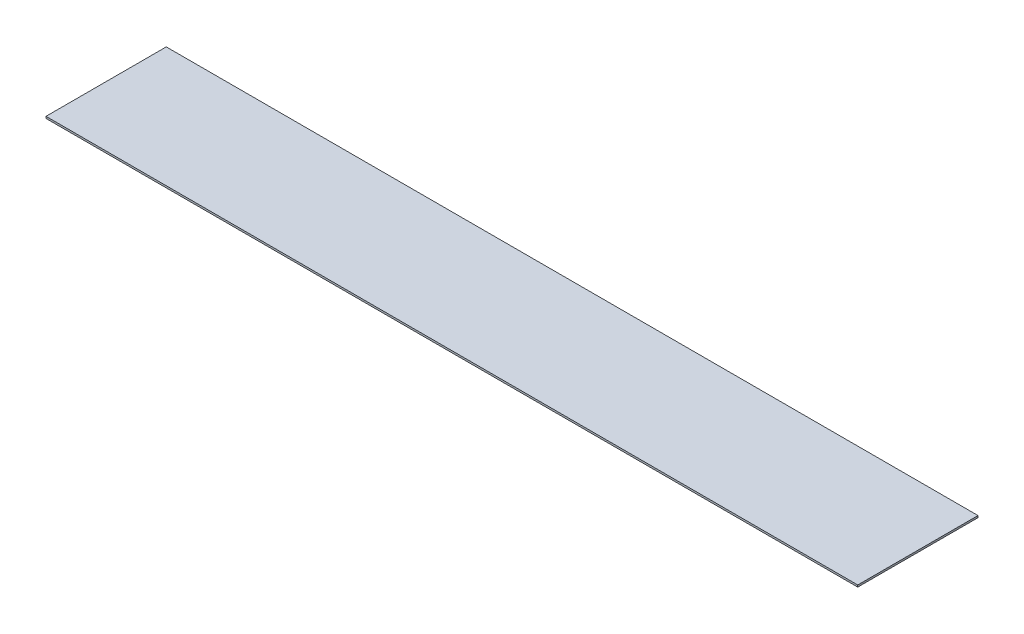
ISO-10303-21;
HEADER;
FILE_DESCRIPTION(('STEP AP214'),'2;1');
FILE_NAME('part.step','',(''),(''),'','','');
FILE_SCHEMA(('AUTOMOTIVE_DESIGN { 1 0 10303 214 1 1 1 1 }'));
ENDSEC;
DATA;
#1=APPLICATION_CONTEXT('core data for automotive mechanical design processes');
#2=APPLICATION_PROTOCOL_DEFINITION('international standard','automotive_design',2000,#1);
#3=PRODUCT_CONTEXT('',#1,'mechanical');
#4=PRODUCT('Part','Part','',(#3));
#5=PRODUCT_RELATED_PRODUCT_CATEGORY('part','',(#4));
#6=PRODUCT_DEFINITION_FORMATION('','',#4);
#7=PRODUCT_DEFINITION_CONTEXT('part definition',#1,'design');
#8=PRODUCT_DEFINITION('design','',#6,#7);
#9=PRODUCT_DEFINITION_SHAPE('','',#8);
#10=(LENGTH_UNIT() NAMED_UNIT(*) SI_UNIT(.MILLI.,.METRE.));
#11=(NAMED_UNIT(*) PLANE_ANGLE_UNIT() SI_UNIT($,.RADIAN.));
#12=(NAMED_UNIT(*) SI_UNIT($,.STERADIAN.) SOLID_ANGLE_UNIT());
#13=UNCERTAINTY_MEASURE_WITH_UNIT(LENGTH_MEASURE(1.E-05),#10,'distance_accuracy_value','');
#14=(GEOMETRIC_REPRESENTATION_CONTEXT(3) GLOBAL_UNCERTAINTY_ASSIGNED_CONTEXT((#13)) GLOBAL_UNIT_ASSIGNED_CONTEXT((#10,
#11,#12)) REPRESENTATION_CONTEXT('',''));
#15=CARTESIAN_POINT('',(0.,0.,0.));
#16=DIRECTION('',(0.,0.,1.));
#17=DIRECTION('',(1.,0.,0.));
#18=AXIS2_PLACEMENT_3D('',#15,#16,#17);
#19=CARTESIAN_POINT('',(0.,1.5875,0.));
#20=DIRECTION('',(1.,0.,0.));
#21=DIRECTION('',(0.,0.,-1.));
#22=AXIS2_PLACEMENT_3D('',#19,#20,#21);
#23=PLANE('',#22);
#24=DIRECTION('',(0.,0.,1.));
#25=VECTOR('',#24,1.);
#26=CARTESIAN_POINT('',(0.,0.,0.));
#27=LINE('',#26,#25);
#28=CARTESIAN_POINT('',(0.,0.,-101.6));
#29=VERTEX_POINT('',#28);
#30=CARTESIAN_POINT('',(0.,0.,0.));
#31=VERTEX_POINT('',#30);
#32=EDGE_CURVE('E96',#29,#31,#27,.T.);
#33=ORIENTED_EDGE('',*,*,#32,.T.);
#34=DIRECTION('',(0.,-1.,0.));
#35=VECTOR('',#34,1.);
#36=CARTESIAN_POINT('',(0.,1.5875,0.));
#37=LINE('',#36,#35);
#38=CARTESIAN_POINT('',(0.,1.5875,0.));
#39=VERTEX_POINT('',#38);
#40=EDGE_CURVE('E11',#39,#31,#37,.T.);
#41=ORIENTED_EDGE('',*,*,#40,.F.);
#42=DIRECTION('',(0.,0.,1.));
#43=VECTOR('',#42,1.);
#44=CARTESIAN_POINT('',(0.,1.5875,0.));
#45=LINE('',#44,#43);
#46=CARTESIAN_POINT('',(0.,1.5875,-101.6));
#47=VERTEX_POINT('',#46);
#48=EDGE_CURVE('E84',#47,#39,#45,.T.);
#49=ORIENTED_EDGE('',*,*,#48,.F.);
#50=DIRECTION('',(0.,-1.,0.));
#51=VECTOR('',#50,1.);
#52=CARTESIAN_POINT('',(0.,1.5875,-101.6));
#53=LINE('',#52,#51);
#54=EDGE_CURVE('E92',#47,#29,#53,.T.);
#55=ORIENTED_EDGE('',*,*,#54,.T.);
#56=EDGE_LOOP('',(#33,#41,#49,#55));
#57=FACE_BOUND('',#56,.T.);
#58=ADVANCED_FACE('F33',(#57),#23,.F.);
#59=CARTESIAN_POINT('',(0.,1.5875,0.));
#60=DIRECTION('',(0.,0.,-1.));
#61=DIRECTION('',(-1.,0.,0.));
#62=AXIS2_PLACEMENT_3D('',#59,#60,#61);
#63=PLANE('',#62);
#64=DIRECTION('',(1.,0.,0.));
#65=VECTOR('',#64,1.);
#66=CARTESIAN_POINT('',(0.,0.,0.));
#67=LINE('',#66,#65);
#68=CARTESIAN_POINT('',(685.8,0.,0.));
#69=VERTEX_POINT('',#68);
#70=EDGE_CURVE('E88',#31,#69,#67,.T.);
#71=ORIENTED_EDGE('',*,*,#70,.T.);
#72=DIRECTION('',(0.,-1.,0.));
#73=VECTOR('',#72,1.);
#74=CARTESIAN_POINT('',(685.8,1.5875,0.));
#75=LINE('',#74,#73);
#76=CARTESIAN_POINT('',(685.8,1.5875,0.));
#77=VERTEX_POINT('',#76);
#78=EDGE_CURVE('E41',#77,#69,#75,.T.);
#79=ORIENTED_EDGE('',*,*,#78,.F.);
#80=DIRECTION('',(1.,0.,0.));
#81=VECTOR('',#80,1.);
#82=CARTESIAN_POINT('',(0.,1.5875,0.));
#83=LINE('',#82,#81);
#84=EDGE_CURVE('E79',#39,#77,#83,.T.);
#85=ORIENTED_EDGE('',*,*,#84,.F.);
#86=ORIENTED_EDGE('',*,*,#40,.T.);
#87=EDGE_LOOP('',(#71,#79,#85,#86));
#88=FACE_BOUND('',#87,.T.);
#89=ADVANCED_FACE('F87',(#88),#63,.F.);
#90=CARTESIAN_POINT('',(685.8,1.5875,0.));
#91=DIRECTION('',(-1.,0.,0.));
#92=DIRECTION('',(0.,0.,1.));
#93=AXIS2_PLACEMENT_3D('',#90,#91,#92);
#94=PLANE('',#93);
#95=DIRECTION('',(0.,0.,-1.));
#96=VECTOR('',#95,1.);
#97=CARTESIAN_POINT('',(685.8,0.,0.));
#98=LINE('',#97,#96);
#99=CARTESIAN_POINT('',(685.8,0.,-101.6));
#100=VERTEX_POINT('',#99);
#101=EDGE_CURVE('E66',#69,#100,#98,.T.);
#102=ORIENTED_EDGE('',*,*,#101,.T.);
#103=DIRECTION('',(0.,-1.,0.));
#104=VECTOR('',#103,1.);
#105=CARTESIAN_POINT('',(685.8,1.5875,-101.6));
#106=LINE('',#105,#104);
#107=CARTESIAN_POINT('',(685.8,1.5875,-101.6));
#108=VERTEX_POINT('',#107);
#109=EDGE_CURVE('E89',#108,#100,#106,.T.);
#110=ORIENTED_EDGE('',*,*,#109,.F.);
#111=DIRECTION('',(0.,0.,-1.));
#112=VECTOR('',#111,1.);
#113=CARTESIAN_POINT('',(685.8,1.5875,0.));
#114=LINE('',#113,#112);
#115=EDGE_CURVE('E82',#77,#108,#114,.T.);
#116=ORIENTED_EDGE('',*,*,#115,.F.);
#117=ORIENTED_EDGE('',*,*,#78,.T.);
#118=EDGE_LOOP('',(#102,#110,#116,#117));
#119=FACE_BOUND('',#118,.T.);
#120=ADVANCED_FACE('F90',(#119),#94,.F.);
#121=CARTESIAN_POINT('',(0.,1.5875,-101.6));
#122=DIRECTION('',(0.,0.,1.));
#123=DIRECTION('',(1.,0.,0.));
#124=AXIS2_PLACEMENT_3D('',#121,#122,#123);
#125=PLANE('',#124);
#126=DIRECTION('',(-1.,0.,0.));
#127=VECTOR('',#126,1.);
#128=CARTESIAN_POINT('',(0.,0.,-101.6));
#129=LINE('',#128,#127);
#130=EDGE_CURVE('E72',#100,#29,#129,.T.);
#131=ORIENTED_EDGE('',*,*,#130,.T.);
#132=ORIENTED_EDGE('',*,*,#54,.F.);
#133=DIRECTION('',(-1.,0.,0.));
#134=VECTOR('',#133,1.);
#135=CARTESIAN_POINT('',(0.,1.5875,-101.6));
#136=LINE('',#135,#134);
#137=EDGE_CURVE('E49',#108,#47,#136,.T.);
#138=ORIENTED_EDGE('',*,*,#137,.F.);
#139=ORIENTED_EDGE('',*,*,#109,.T.);
#140=EDGE_LOOP('',(#131,#132,#138,#139));
#141=FACE_BOUND('',#140,.T.);
#142=ADVANCED_FACE('F103',(#141),#125,.F.);
#143=CARTESIAN_POINT('',(0.,1.5875,0.));
#144=DIRECTION('',(0.,-1.,0.));
#145=DIRECTION('',(0.,0.,-1.));
#146=AXIS2_PLACEMENT_3D('',#143,#144,#145);
#147=PLANE('',#146);
#148=ORIENTED_EDGE('',*,*,#48,.T.);
#149=ORIENTED_EDGE('',*,*,#84,.T.);
#150=ORIENTED_EDGE('',*,*,#115,.T.);
#151=ORIENTED_EDGE('',*,*,#137,.T.);
#152=EDGE_LOOP('',(#148,#149,#150,#151));
#153=FACE_BOUND('',#152,.T.);
#154=ADVANCED_FACE('F80',(#153),#147,.F.);
#155=CARTESIAN_POINT('',(0.,0.,0.));
#156=DIRECTION('',(0.,-1.,0.));
#157=DIRECTION('',(0.,0.,-1.));
#158=AXIS2_PLACEMENT_3D('',#155,#156,#157);
#159=PLANE('',#158);
#160=ORIENTED_EDGE('',*,*,#32,.F.);
#161=ORIENTED_EDGE('',*,*,#130,.F.);
#162=ORIENTED_EDGE('',*,*,#101,.F.);
#163=ORIENTED_EDGE('',*,*,#70,.F.);
#164=EDGE_LOOP('',(#160,#161,#162,#163));
#165=FACE_BOUND('',#164,.T.);
#166=ADVANCED_FACE('F106',(#165),#159,.T.);
#167=CLOSED_SHELL('',(#58,#89,#120,#142,#154,#166));
#168=MANIFOLD_SOLID_BREP('B2',#167);
#169=ADVANCED_BREP_SHAPE_REPRESENTATION('',(#18,#168),#14);
#170=SHAPE_DEFINITION_REPRESENTATION(#9,#169);
ENDSEC;
END-ISO-10303-21;
